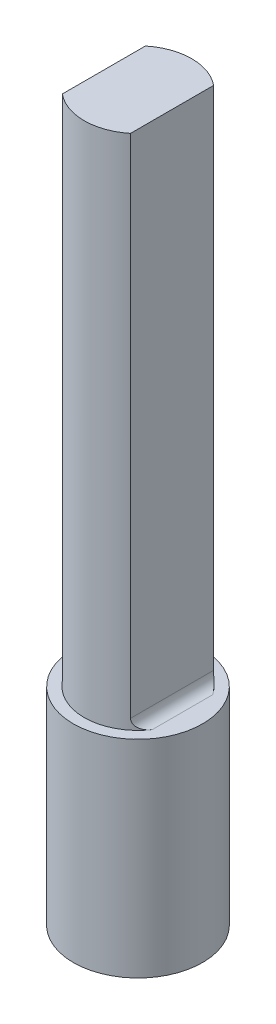
ISO-10303-21;
HEADER;
FILE_DESCRIPTION(('STEP AP214'),'2;1');
FILE_NAME('part.step','',(''),(''),'','','');
FILE_SCHEMA(('AUTOMOTIVE_DESIGN { 1 0 10303 214 1 1 1 1 }'));
ENDSEC;
DATA;
#1=APPLICATION_CONTEXT('core data for automotive mechanical design processes');
#2=APPLICATION_PROTOCOL_DEFINITION('international standard','automotive_design',2000,#1);
#3=PRODUCT_CONTEXT('',#1,'mechanical');
#4=PRODUCT('Part','Part','',(#3));
#5=PRODUCT_RELATED_PRODUCT_CATEGORY('part','',(#4));
#6=PRODUCT_DEFINITION_FORMATION('','',#4);
#7=PRODUCT_DEFINITION_CONTEXT('part definition',#1,'design');
#8=PRODUCT_DEFINITION('design','',#6,#7);
#9=PRODUCT_DEFINITION_SHAPE('','',#8);
#10=(LENGTH_UNIT() NAMED_UNIT(*) SI_UNIT(.MILLI.,.METRE.));
#11=(NAMED_UNIT(*) PLANE_ANGLE_UNIT() SI_UNIT($,.RADIAN.));
#12=(NAMED_UNIT(*) SI_UNIT($,.STERADIAN.) SOLID_ANGLE_UNIT());
#13=UNCERTAINTY_MEASURE_WITH_UNIT(LENGTH_MEASURE(1.E-05),#10,'distance_accuracy_value','');
#14=(GEOMETRIC_REPRESENTATION_CONTEXT(3) GLOBAL_UNCERTAINTY_ASSIGNED_CONTEXT((#13)) GLOBAL_UNIT_ASSIGNED_CONTEXT((#10,
#11,#12)) REPRESENTATION_CONTEXT('',''));
#15=CARTESIAN_POINT('',(0.,0.,0.));
#16=DIRECTION('',(0.,0.,1.));
#17=DIRECTION('',(1.,0.,0.));
#18=AXIS2_PLACEMENT_3D('',#15,#16,#17);
#19=CARTESIAN_POINT('',(0.,5.,0.));
#20=DIRECTION('',(0.,-1.,0.));
#21=DIRECTION('',(0.,0.,-1.));
#22=AXIS2_PLACEMENT_3D('',#19,#20,#21);
#23=CYLINDRICAL_SURFACE('',#22,3.125);
#24=CARTESIAN_POINT('',(0.,5.,0.));
#25=DIRECTION('',(0.,1.,0.));
#26=DIRECTION('',(0.,0.,1.));
#27=AXIS2_PLACEMENT_3D('',#24,#25,#26);
#28=CIRCLE('',#27,3.125);
#29=CARTESIAN_POINT('',(0.,5.,3.125));
#30=VERTEX_POINT('',#29);
#31=EDGE_CURVE('E132',#30,#30,#28,.T.);
#32=ORIENTED_EDGE('',*,*,#31,.F.);
#33=EDGE_LOOP('',(#32));
#34=FACE_BOUND('',#33,.T.);
#35=CARTESIAN_POINT('',(0.,-5.,0.));
#36=DIRECTION('',(0.,1.,0.));
#37=DIRECTION('',(0.,0.,1.));
#38=AXIS2_PLACEMENT_3D('',#35,#36,#37);
#39=CIRCLE('',#38,3.125);
#40=CARTESIAN_POINT('',(0.,-5.,3.125));
#41=VERTEX_POINT('',#40);
#42=EDGE_CURVE('E127',#41,#41,#39,.T.);
#43=ORIENTED_EDGE('',*,*,#42,.T.);
#44=EDGE_LOOP('',(#43));
#45=FACE_BOUND('',#44,.T.);
#46=ADVANCED_FACE('F38',(#34,#45),#23,.T.);
#47=CARTESIAN_POINT('',(0.,5.,0.));
#48=DIRECTION('',(0.,1.,0.));
#49=DIRECTION('',(0.,0.,1.));
#50=AXIS2_PLACEMENT_3D('',#47,#48,#49);
#51=PLANE('',#50);
#52=CARTESIAN_POINT('',(0.,5.,0.));
#53=DIRECTION('',(0.,1.,0.));
#54=DIRECTION('',(0.,0.,1.));
#55=AXIS2_PLACEMENT_3D('',#52,#53,#54);
#56=CIRCLE('',#55,2.6);
#57=CARTESIAN_POINT('',(2.15,5.,-1.46201915172134));
#58=VERTEX_POINT('',#57);
#59=CARTESIAN_POINT('',(-2.15,5.,-1.46201915172134));
#60=VERTEX_POINT('',#59);
#61=EDGE_CURVE('E121',#58,#60,#56,.T.);
#62=ORIENTED_EDGE('',*,*,#61,.F.);
#63=DIRECTION('',(0.,0.,-1.));
#64=VECTOR('',#63,1.);
#65=CARTESIAN_POINT('',(2.15,5.,0.));
#66=LINE('',#65,#64);
#67=CARTESIAN_POINT('',(2.15,5.,1.46201915172134));
#68=VERTEX_POINT('',#67);
#69=EDGE_CURVE('E148',#58,#68,#66,.F.);
#70=ORIENTED_EDGE('',*,*,#69,.T.);
#71=CARTESIAN_POINT('',(0.,5.,0.));
#72=DIRECTION('',(0.,1.,0.));
#73=DIRECTION('',(0.,0.,1.));
#74=AXIS2_PLACEMENT_3D('',#71,#72,#73);
#75=CIRCLE('',#74,2.6);
#76=CARTESIAN_POINT('',(-2.15,5.,1.46201915172134));
#77=VERTEX_POINT('',#76);
#78=EDGE_CURVE('E197',#77,#68,#75,.T.);
#79=ORIENTED_EDGE('',*,*,#78,.F.);
#80=DIRECTION('',(0.,0.,1.));
#81=VECTOR('',#80,1.);
#82=CARTESIAN_POINT('',(-2.15,5.,0.));
#83=LINE('',#82,#81);
#84=EDGE_CURVE('E144',#77,#60,#83,.F.);
#85=ORIENTED_EDGE('',*,*,#84,.T.);
#86=EDGE_LOOP('',(#62,#70,#79,#85));
#87=FACE_BOUND('',#86,.T.);
#88=ORIENTED_EDGE('',*,*,#31,.T.);
#89=EDGE_LOOP('',(#88));
#90=FACE_BOUND('',#89,.T.);
#91=ADVANCED_FACE('F180',(#87,#90),#51,.T.);
#92=CARTESIAN_POINT('',(0.,-5.,0.));
#93=DIRECTION('',(0.,1.,0.));
#94=DIRECTION('',(0.,0.,1.));
#95=AXIS2_PLACEMENT_3D('',#92,#93,#94);
#96=PLANE('',#95);
#97=ORIENTED_EDGE('',*,*,#42,.F.);
#98=EDGE_LOOP('',(#97));
#99=FACE_BOUND('',#98,.T.);
#100=ADVANCED_FACE('F182',(#99),#96,.F.);
#101=CARTESIAN_POINT('',(0.,30.,0.));
#102=DIRECTION('',(0.,-1.,0.));
#103=DIRECTION('',(0.,0.,-1.));
#104=AXIS2_PLACEMENT_3D('',#101,#102,#103);
#105=CYLINDRICAL_SURFACE('',#104,2.6);
#106=ORIENTED_EDGE('',*,*,#78,.T.);
#107=CARTESIAN_POINT('',(2.15,5.,1.46201915172134));
#108=CARTESIAN_POINT('',(2.13214893926979,5.00000870419004,1.48828019076594));
#109=CARTESIAN_POINT('',(2.11379233462878,5.00095772820948,1.51423071888645));
#110=CARTESIAN_POINT('',(2.07615080757069,5.00511696251503,1.56544076001844));
#111=CARTESIAN_POINT('',(2.05686203017962,5.00833747457193,1.59069657807328));
#112=CARTESIAN_POINT('',(2.01731775489546,5.01749349777636,1.6405662280391));
#113=CARTESIAN_POINT('',(1.9970522414764,5.02346804601395,1.66516525887419));
#114=CARTESIAN_POINT('',(1.95617554190187,5.03858257771035,1.71299845862608));
#115=CARTESIAN_POINT('',(1.93556517218849,5.04771587882874,1.73623538866302));
#116=CARTESIAN_POINT('',(1.89400814855079,5.06984491198724,1.78148667531625));
#117=CARTESIAN_POINT('',(1.87306306365448,5.08291459991408,1.80346706348541));
#118=CARTESIAN_POINT('',(1.8320739485162,5.11325827221602,1.84508878206222));
#119=CARTESIAN_POINT('',(1.81202630739307,5.13051319214058,1.86474013387851));
#120=CARTESIAN_POINT('',(1.77671780038985,5.16654103670392,1.89836118260811));
#121=CARTESIAN_POINT('',(1.76119516866958,5.18467122856801,1.91273981687796));
#122=CARTESIAN_POINT('',(1.73224540378138,5.22417575325125,1.93899654069926));
#123=CARTESIAN_POINT('',(1.71881776056849,5.24554929393869,1.95087523913044));
#124=CARTESIAN_POINT('',(1.69679483755491,5.28768023203842,1.97004251878954));
#125=CARTESIAN_POINT('',(1.68777322159316,5.30802035739621,1.97775707271938));
#126=CARTESIAN_POINT('',(1.67237835886704,5.35038785051409,1.9907919512184));
#127=CARTESIAN_POINT('',(1.66600122472005,5.37241268489551,1.99611579109406));
#128=CARTESIAN_POINT('',(1.65748788633574,5.41204514924781,2.00318687499706));
#129=CARTESIAN_POINT('',(1.65469602119519,5.42941624755442,2.00549031907575));
#130=CARTESIAN_POINT('',(1.65094466146425,5.4645198100488,2.00857740091236));
#131=CARTESIAN_POINT('',(1.64998857491628,5.48225288469731,2.00935821201079));
#132=CARTESIAN_POINT('',(1.65,5.5,2.00935312974101));
#133=B_SPLINE_CURVE_WITH_KNOTS('',3,(#107,#108,#109,#110,#111,#112,#113,#114,#115,#116,#117,
#118,#119,#120,#121,#122,#123,#124,#125,#126,#127,#128,#129,#130,#131,#132),.UNSPECIFIED.,.F.,
.F.,(4,2,2,2,2,2,2,2,2,2,2,2,4),(0.,0.0952835776654717,0.191002092392971,0.288121186733857,
0.385036069844265,0.483899246282999,0.582320273217879,0.665588173496876,0.748835769669889,
0.819190036406662,0.889440512736169,0.942515985758388,0.995689896160677),.UNSPECIFIED.);
#134=CARTESIAN_POINT('',(1.65,5.5,2.00935312974101));
#135=VERTEX_POINT('',#134);
#136=EDGE_CURVE('E125',#68,#135,#133,.T.);
#137=ORIENTED_EDGE('',*,*,#136,.T.);
#138=DIRECTION('',(0.,-1.,0.));
#139=VECTOR('',#138,1.);
#140=CARTESIAN_POINT('',(1.65,30.,2.00935312974101));
#141=LINE('',#140,#139);
#142=CARTESIAN_POINT('',(1.65,30.,2.00935312974101));
#143=VERTEX_POINT('',#142);
#144=EDGE_CURVE('E103',#143,#135,#141,.T.);
#145=ORIENTED_EDGE('',*,*,#144,.F.);
#146=CARTESIAN_POINT('',(0.,30.,0.));
#147=DIRECTION('',(0.,1.,0.));
#148=DIRECTION('',(0.,0.,1.));
#149=AXIS2_PLACEMENT_3D('',#146,#147,#148);
#150=CIRCLE('',#149,2.6);
#151=CARTESIAN_POINT('',(-1.65,30.,2.00935312974101));
#152=VERTEX_POINT('',#151);
#153=EDGE_CURVE('E111',#152,#143,#150,.T.);
#154=ORIENTED_EDGE('',*,*,#153,.F.);
#155=DIRECTION('',(0.,-1.,0.));
#156=VECTOR('',#155,1.);
#157=CARTESIAN_POINT('',(-1.65,30.,2.00935312974101));
#158=LINE('',#157,#156);
#159=CARTESIAN_POINT('',(-1.65,5.5,2.00935312974101));
#160=VERTEX_POINT('',#159);
#161=EDGE_CURVE('E198',#152,#160,#158,.T.);
#162=ORIENTED_EDGE('',*,*,#161,.T.);
#163=CARTESIAN_POINT('',(-1.65,5.5,2.00935312974101));
#164=CARTESIAN_POINT('',(-1.64996359471725,5.47681076749336,2.00937109235813));
#165=CARTESIAN_POINT('',(-1.65161080389504,5.45365308239492,2.00803048983314));
#166=CARTESIAN_POINT('',(-1.6579790276271,5.40818822793188,2.00278177353478));
#167=CARTESIAN_POINT('',(-1.66268321653932,5.3858771063642,1.99888771295884));
#168=CARTESIAN_POINT('',(-1.67487061306382,5.34265031230238,1.98868478727566));
#169=CARTESIAN_POINT('',(-1.68235059713593,5.32173305421646,1.9823787229766));
#170=CARTESIAN_POINT('',(-1.69964205747362,5.28170356649006,1.96757389514596));
#171=CARTESIAN_POINT('',(-1.70945623319133,5.2625934628228,1.95907259187564));
#172=CARTESIAN_POINT('',(-1.73150111467578,5.22550119731475,1.93962116379359));
#173=CARTESIAN_POINT('',(-1.74383455457759,5.20763770909652,1.9285626214157));
#174=CARTESIAN_POINT('',(-1.76995105661626,5.17440846214165,1.90462282646724));
#175=CARTESIAN_POINT('',(-1.78373364992343,5.15904189967053,1.8917421629258));
#176=CARTESIAN_POINT('',(-1.81979638970047,5.12329378355633,1.85721444602951));
#177=CARTESIAN_POINT('',(-1.84271748159403,5.10455454989635,1.83453237371767));
#178=CARTESIAN_POINT('',(-1.88948319843094,5.07227839807329,1.78633467373363));
#179=CARTESIAN_POINT('',(-1.91333275460446,5.05877519311738,1.760802003668));
#180=CARTESIAN_POINT('',(-1.95584582695472,5.03877036355263,1.71331834986592));
#181=CARTESIAN_POINT('',(-1.97453999191053,5.03139210363866,1.69175102240118));
#182=CARTESIAN_POINT('',(-2.01155764044862,5.01915262909687,1.64756412692859));
#183=CARTESIAN_POINT('',(-2.02988058714538,5.01429484035404,1.62494317205063));
#184=CARTESIAN_POINT('',(-2.06561235508679,5.00684003118643,1.57926309675821));
#185=CARTESIAN_POINT('',(-2.0830313347159,5.00420659281877,1.55621761265066));
#186=CARTESIAN_POINT('',(-2.11710338397585,5.00079243236116,1.50953976907778));
#187=CARTESIAN_POINT('',(-2.13375865793499,5.00000599940425,1.48590944751401));
#188=CARTESIAN_POINT('',(-2.15,5.,1.46201915172134));
#189=B_SPLINE_CURVE_WITH_KNOTS('',3,(#163,#164,#165,#166,#167,#168,#169,#170,#171,#172,#173,
#174,#175,#176,#177,#178,#179,#180,#181,#182,#183,#184,#185,#186,#187,#188),.UNSPECIFIED.,.F.,
.F.,(4,2,2,2,2,2,2,2,2,2,2,2,4),(0.,0.0694209217901271,0.138462949974686,0.207425049061173,
0.27646729277555,0.349281770719914,0.422072763809251,0.533338164048136,0.645308522464324,
0.73361190587309,0.822035000995784,0.908980676152649,0.995657162792072),.UNSPECIFIED.);
#190=EDGE_CURVE('E53',#160,#77,#189,.T.);
#191=ORIENTED_EDGE('',*,*,#190,.T.);
#192=EDGE_LOOP('',(#106,#137,#145,#154,#162,#191));
#193=FACE_BOUND('',#192,.T.);
#194=ADVANCED_FACE('F123',(#193),#105,.T.);
#195=CARTESIAN_POINT('',(1.65,30.,-2.00935312974101));
#196=DIRECTION('',(-1.,0.,0.));
#197=DIRECTION('',(0.,0.,1.));
#198=AXIS2_PLACEMENT_3D('',#195,#196,#197);
#199=PLANE('',#198);
#200=ORIENTED_EDGE('',*,*,#144,.T.);
#201=DIRECTION('',(0.,0.,-1.));
#202=VECTOR('',#201,1.);
#203=CARTESIAN_POINT('',(1.65,5.5,-2.00935312974101));
#204=LINE('',#203,#202);
#205=CARTESIAN_POINT('',(1.65,5.5,-2.00935312974101));
#206=VERTEX_POINT('',#205);
#207=EDGE_CURVE('E140',#135,#206,#204,.T.);
#208=ORIENTED_EDGE('',*,*,#207,.T.);
#209=DIRECTION('',(0.,-1.,0.));
#210=VECTOR('',#209,1.);
#211=CARTESIAN_POINT('',(1.65,30.,-2.00935312974101));
#212=LINE('',#211,#210);
#213=CARTESIAN_POINT('',(1.65,30.,-2.00935312974101));
#214=VERTEX_POINT('',#213);
#215=EDGE_CURVE('E106',#214,#206,#212,.T.);
#216=ORIENTED_EDGE('',*,*,#215,.F.);
#217=DIRECTION('',(0.,0.,-1.));
#218=VECTOR('',#217,1.);
#219=CARTESIAN_POINT('',(1.65,30.,-2.00935312974101));
#220=LINE('',#219,#218);
#221=EDGE_CURVE('E98',#143,#214,#220,.T.);
#222=ORIENTED_EDGE('',*,*,#221,.F.);
#223=EDGE_LOOP('',(#200,#208,#216,#222));
#224=FACE_BOUND('',#223,.T.);
#225=ADVANCED_FACE('F100',(#224),#199,.F.);
#226=CARTESIAN_POINT('',(0.,30.,0.));
#227=DIRECTION('',(0.,-1.,0.));
#228=DIRECTION('',(0.,0.,-1.));
#229=AXIS2_PLACEMENT_3D('',#226,#227,#228);
#230=CYLINDRICAL_SURFACE('',#229,2.6);
#231=ORIENTED_EDGE('',*,*,#61,.T.);
#232=CARTESIAN_POINT('',(-2.15,5.,-1.46201915172134));
#233=CARTESIAN_POINT('',(-2.13214893926979,5.00000870419004,-1.48828019076594));
#234=CARTESIAN_POINT('',(-2.11379233462878,5.00095772820948,-1.51423071888645));
#235=CARTESIAN_POINT('',(-2.07615080757069,5.00511696251503,-1.56544076001844));
#236=CARTESIAN_POINT('',(-2.05686203017962,5.00833747457193,-1.59069657807328));
#237=CARTESIAN_POINT('',(-2.01731775489546,5.01749349777636,-1.6405662280391));
#238=CARTESIAN_POINT('',(-1.9970522414764,5.02346804601395,-1.66516525887419));
#239=CARTESIAN_POINT('',(-1.95617554190187,5.03858257771035,-1.71299845862608));
#240=CARTESIAN_POINT('',(-1.93556517218849,5.04771587882874,-1.73623538866302));
#241=CARTESIAN_POINT('',(-1.89400814855079,5.06984491198724,-1.78148667531625));
#242=CARTESIAN_POINT('',(-1.87306306365448,5.08291459991408,-1.80346706348541));
#243=CARTESIAN_POINT('',(-1.8320739485162,5.11325827221602,-1.84508878206222));
#244=CARTESIAN_POINT('',(-1.81202630739307,5.13051319214058,-1.86474013387851));
#245=CARTESIAN_POINT('',(-1.77671780038985,5.16654103670392,-1.89836118260811));
#246=CARTESIAN_POINT('',(-1.76119516866959,5.18467122856801,-1.91273981687796));
#247=CARTESIAN_POINT('',(-1.73224540378138,5.22417575325125,-1.93899654069926));
#248=CARTESIAN_POINT('',(-1.71881776056849,5.24554929393869,-1.95087523913044));
#249=CARTESIAN_POINT('',(-1.69679483755491,5.28768023203842,-1.97004251878954));
#250=CARTESIAN_POINT('',(-1.68777322159316,5.30802035739621,-1.97775707271938));
#251=CARTESIAN_POINT('',(-1.67237835886704,5.35038785051409,-1.9907919512184));
#252=CARTESIAN_POINT('',(-1.66600122472005,5.37241268489551,-1.99611579109406));
#253=CARTESIAN_POINT('',(-1.65748788633574,5.41204514924781,-2.00318687499706));
#254=CARTESIAN_POINT('',(-1.65469602119519,5.42941624755442,-2.00549031907575));
#255=CARTESIAN_POINT('',(-1.65094466146425,5.4645198100488,-2.00857740091236));
#256=CARTESIAN_POINT('',(-1.64998857491628,5.48225288469731,-2.00935821201079));
#257=CARTESIAN_POINT('',(-1.65,5.5,-2.00935312974101));
#258=B_SPLINE_CURVE_WITH_KNOTS('',3,(#232,#233,#234,#235,#236,#237,#238,#239,#240,#241,#242,
#243,#244,#245,#246,#247,#248,#249,#250,#251,#252,#253,#254,#255,#256,#257),.UNSPECIFIED.,.F.,
.F.,(4,2,2,2,2,2,2,2,2,2,2,2,4),(0.,0.0952835776654716,0.191002092392971,0.288121186733858,
0.385036069844266,0.483899246283,0.58232027321788,0.665588173496877,0.748835769669889,
0.819190036406662,0.88944051273617,0.942515985758388,0.995689896160678),.UNSPECIFIED.);
#259=CARTESIAN_POINT('',(-1.65,5.5,-2.00935312974101));
#260=VERTEX_POINT('',#259);
#261=EDGE_CURVE('E11',#60,#260,#258,.T.);
#262=ORIENTED_EDGE('',*,*,#261,.T.);
#263=DIRECTION('',(0.,-1.,0.));
#264=VECTOR('',#263,1.);
#265=CARTESIAN_POINT('',(-1.65,30.,-2.00935312974101));
#266=LINE('',#265,#264);
#267=CARTESIAN_POINT('',(-1.65,30.,-2.00935312974101));
#268=VERTEX_POINT('',#267);
#269=EDGE_CURVE('E134',#268,#260,#266,.T.);
#270=ORIENTED_EDGE('',*,*,#269,.F.);
#271=CARTESIAN_POINT('',(0.,30.,0.));
#272=DIRECTION('',(0.,1.,0.));
#273=DIRECTION('',(0.,0.,1.));
#274=AXIS2_PLACEMENT_3D('',#271,#272,#273);
#275=CIRCLE('',#274,2.6);
#276=EDGE_CURVE('E110',#214,#268,#275,.T.);
#277=ORIENTED_EDGE('',*,*,#276,.F.);
#278=ORIENTED_EDGE('',*,*,#215,.T.);
#279=CARTESIAN_POINT('',(1.65,5.5,-2.00935312974101));
#280=CARTESIAN_POINT('',(1.64996359471725,5.47681076749336,-2.00937109235813));
#281=CARTESIAN_POINT('',(1.65161080389504,5.45365308239492,-2.00803048983314));
#282=CARTESIAN_POINT('',(1.6579790276271,5.40818822793188,-2.00278177353478));
#283=CARTESIAN_POINT('',(1.66268321653932,5.3858771063642,-1.99888771295884));
#284=CARTESIAN_POINT('',(1.67487061306382,5.34265031230238,-1.98868478727566));
#285=CARTESIAN_POINT('',(1.68235059713593,5.32173305421646,-1.9823787229766));
#286=CARTESIAN_POINT('',(1.69964205747362,5.28170356649006,-1.96757389514596));
#287=CARTESIAN_POINT('',(1.70945623319133,5.2625934628228,-1.95907259187564));
#288=CARTESIAN_POINT('',(1.73150111467578,5.22550119731475,-1.93962116379359));
#289=CARTESIAN_POINT('',(1.74383455457759,5.20763770909652,-1.9285626214157));
#290=CARTESIAN_POINT('',(1.76995105661626,5.17440846214165,-1.90462282646724));
#291=CARTESIAN_POINT('',(1.78373364992343,5.15904189967053,-1.8917421629258));
#292=CARTESIAN_POINT('',(1.81979638970047,5.12329378355633,-1.85721444602951));
#293=CARTESIAN_POINT('',(1.84271748159403,5.10455454989635,-1.83453237371767));
#294=CARTESIAN_POINT('',(1.88948319843094,5.07227839807329,-1.78633467373363));
#295=CARTESIAN_POINT('',(1.91333275460446,5.05877519311738,-1.760802003668));
#296=CARTESIAN_POINT('',(1.95584582695472,5.03877036355263,-1.71331834986592));
#297=CARTESIAN_POINT('',(1.97453999191053,5.03139210363866,-1.69175102240118));
#298=CARTESIAN_POINT('',(2.01155764044862,5.01915262909687,-1.64756412692859));
#299=CARTESIAN_POINT('',(2.02988058714538,5.01429484035404,-1.62494317205063));
#300=CARTESIAN_POINT('',(2.06561235508679,5.00684003118643,-1.57926309675821));
#301=CARTESIAN_POINT('',(2.0830313347159,5.00420659281877,-1.55621761265066));
#302=CARTESIAN_POINT('',(2.11710338397585,5.00079243236116,-1.50953976907778));
#303=CARTESIAN_POINT('',(2.13375865793499,5.00000599940425,-1.48590944751401));
#304=CARTESIAN_POINT('',(2.15,5.,-1.46201915172134));
#305=B_SPLINE_CURVE_WITH_KNOTS('',3,(#279,#280,#281,#282,#283,#284,#285,#286,#287,#288,#289,
#290,#291,#292,#293,#294,#295,#296,#297,#298,#299,#300,#301,#302,#303,#304),.UNSPECIFIED.,.F.,
.F.,(4,2,2,2,2,2,2,2,2,2,2,2,4),(0.,0.0694209217901271,0.138462949974686,0.207425049061173,
0.27646729277555,0.349281770719914,0.422072763809251,0.533338164048136,0.645308522464324,
0.733611905873091,0.822035000995784,0.908980676152649,0.995657162792072),.UNSPECIFIED.);
#306=EDGE_CURVE('E155',#206,#58,#305,.T.);
#307=ORIENTED_EDGE('',*,*,#306,.T.);
#308=EDGE_LOOP('',(#231,#262,#270,#277,#278,#307));
#309=FACE_BOUND('',#308,.T.);
#310=ADVANCED_FACE('F168',(#309),#230,.T.);
#311=CARTESIAN_POINT('',(-1.65,30.,2.00935312974101));
#312=DIRECTION('',(1.,0.,0.));
#313=DIRECTION('',(0.,0.,-1.));
#314=AXIS2_PLACEMENT_3D('',#311,#312,#313);
#315=PLANE('',#314);
#316=ORIENTED_EDGE('',*,*,#269,.T.);
#317=DIRECTION('',(0.,0.,1.));
#318=VECTOR('',#317,1.);
#319=CARTESIAN_POINT('',(-1.65,5.5,2.00935312974101));
#320=LINE('',#319,#318);
#321=EDGE_CURVE('E152',#260,#160,#320,.T.);
#322=ORIENTED_EDGE('',*,*,#321,.T.);
#323=ORIENTED_EDGE('',*,*,#161,.F.);
#324=DIRECTION('',(0.,0.,1.));
#325=VECTOR('',#324,1.);
#326=CARTESIAN_POINT('',(-1.65,30.,2.00935312974101));
#327=LINE('',#326,#325);
#328=EDGE_CURVE('E116',#268,#152,#327,.T.);
#329=ORIENTED_EDGE('',*,*,#328,.F.);
#330=EDGE_LOOP('',(#316,#322,#323,#329));
#331=FACE_BOUND('',#330,.T.);
#332=ADVANCED_FACE('F211',(#331),#315,.F.);
#333=CARTESIAN_POINT('',(0.,30.,0.));
#334=DIRECTION('',(0.,1.,0.));
#335=DIRECTION('',(0.,0.,1.));
#336=AXIS2_PLACEMENT_3D('',#333,#334,#335);
#337=PLANE('',#336);
#338=ORIENTED_EDGE('',*,*,#153,.T.);
#339=ORIENTED_EDGE('',*,*,#221,.T.);
#340=ORIENTED_EDGE('',*,*,#276,.T.);
#341=ORIENTED_EDGE('',*,*,#328,.T.);
#342=EDGE_LOOP('',(#338,#339,#340,#341));
#343=FACE_BOUND('',#342,.T.);
#344=ADVANCED_FACE('F114',(#343),#337,.T.);
#345=CARTESIAN_POINT('',(2.15,5.5,-2.00935312974101));
#346=DIRECTION('',(0.,0.,-1.));
#347=DIRECTION('',(-1.,0.,0.));
#348=AXIS2_PLACEMENT_3D('',#345,#346,#347);
#349=CYLINDRICAL_SURFACE('',#348,0.5);
#350=ORIENTED_EDGE('',*,*,#136,.F.);
#351=ORIENTED_EDGE('',*,*,#69,.F.);
#352=ORIENTED_EDGE('',*,*,#306,.F.);
#353=ORIENTED_EDGE('',*,*,#207,.F.);
#354=EDGE_LOOP('',(#350,#351,#352,#353));
#355=FACE_BOUND('',#354,.T.);
#356=ADVANCED_FACE('F172',(#355),#349,.F.);
#357=CARTESIAN_POINT('',(-2.15,5.5,2.00935312974101));
#358=DIRECTION('',(0.,0.,1.));
#359=DIRECTION('',(1.,0.,0.));
#360=AXIS2_PLACEMENT_3D('',#357,#358,#359);
#361=CYLINDRICAL_SURFACE('',#360,0.5);
#362=ORIENTED_EDGE('',*,*,#261,.F.);
#363=ORIENTED_EDGE('',*,*,#84,.F.);
#364=ORIENTED_EDGE('',*,*,#190,.F.);
#365=ORIENTED_EDGE('',*,*,#321,.F.);
#366=EDGE_LOOP('',(#362,#363,#364,#365));
#367=FACE_BOUND('',#366,.T.);
#368=ADVANCED_FACE('F40',(#367),#361,.F.);
#369=CLOSED_SHELL('',(#46,#91,#100,#194,#225,#310,#332,#344,#356,#368));
#370=MANIFOLD_SOLID_BREP('B2',#369);
#371=ADVANCED_BREP_SHAPE_REPRESENTATION('',(#18,#370),#14);
#372=SHAPE_DEFINITION_REPRESENTATION(#9,#371);
ENDSEC;
END-ISO-10303-21;
